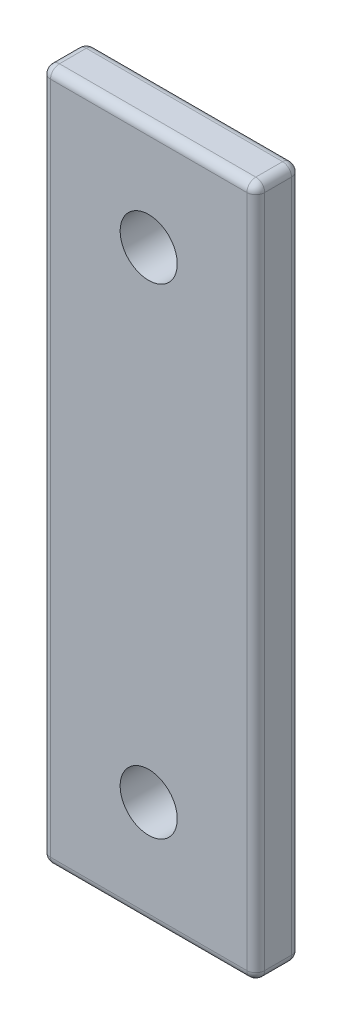
ISO-10303-21;
HEADER;
FILE_DESCRIPTION(('STEP AP214'),'2;1');
FILE_NAME('part.step','',(''),(''),'','','');
FILE_SCHEMA(('AUTOMOTIVE_DESIGN { 1 0 10303 214 1 1 1 1 }'));
ENDSEC;
DATA;
#1=APPLICATION_CONTEXT('core data for automotive mechanical design processes');
#2=APPLICATION_PROTOCOL_DEFINITION('international standard','automotive_design',2000,#1);
#3=PRODUCT_CONTEXT('',#1,'mechanical');
#4=PRODUCT('Part','Part','',(#3));
#5=PRODUCT_RELATED_PRODUCT_CATEGORY('part','',(#4));
#6=PRODUCT_DEFINITION_FORMATION('','',#4);
#7=PRODUCT_DEFINITION_CONTEXT('part definition',#1,'design');
#8=PRODUCT_DEFINITION('design','',#6,#7);
#9=PRODUCT_DEFINITION_SHAPE('','',#8);
#10=(LENGTH_UNIT() NAMED_UNIT(*) SI_UNIT(.MILLI.,.METRE.));
#11=(NAMED_UNIT(*) PLANE_ANGLE_UNIT() SI_UNIT($,.RADIAN.));
#12=(NAMED_UNIT(*) SI_UNIT($,.STERADIAN.) SOLID_ANGLE_UNIT());
#13=UNCERTAINTY_MEASURE_WITH_UNIT(LENGTH_MEASURE(1.E-05),#10,'distance_accuracy_value','');
#14=(GEOMETRIC_REPRESENTATION_CONTEXT(3) GLOBAL_UNCERTAINTY_ASSIGNED_CONTEXT((#13)) GLOBAL_UNIT_ASSIGNED_CONTEXT((#10,
#11,#12)) REPRESENTATION_CONTEXT('',''));
#15=CARTESIAN_POINT('',(0.,0.,0.));
#16=DIRECTION('',(0.,0.,1.));
#17=DIRECTION('',(1.,0.,0.));
#18=AXIS2_PLACEMENT_3D('',#15,#16,#17);
#19=CARTESIAN_POINT('',(24.,-77.5,10.));
#20=DIRECTION('',(-1.,0.,0.));
#21=DIRECTION('',(0.,0.,1.));
#22=AXIS2_PLACEMENT_3D('',#19,#20,#21);
#23=PLANE('',#22);
#24=DIRECTION('',(0.,1.,0.));
#25=VECTOR('',#24,1.);
#26=CARTESIAN_POINT('',(24.,77.5,2.));
#27=LINE('',#26,#25);
#28=CARTESIAN_POINT('',(24.,-75.5,2.));
#29=VERTEX_POINT('',#28);
#30=CARTESIAN_POINT('',(24.,75.5,2.));
#31=VERTEX_POINT('',#30);
#32=EDGE_CURVE('E191',#29,#31,#27,.T.);
#33=ORIENTED_EDGE('',*,*,#32,.T.);
#34=DIRECTION('',(0.,0.,-1.));
#35=VECTOR('',#34,1.);
#36=CARTESIAN_POINT('',(24.,75.5,10.));
#37=LINE('',#36,#35);
#38=CARTESIAN_POINT('',(24.,75.5,8.));
#39=VERTEX_POINT('',#38);
#40=EDGE_CURVE('E238',#31,#39,#37,.F.);
#41=ORIENTED_EDGE('',*,*,#40,.T.);
#42=DIRECTION('',(0.,1.,0.));
#43=VECTOR('',#42,1.);
#44=CARTESIAN_POINT('',(24.,-77.5,8.));
#45=LINE('',#44,#43);
#46=CARTESIAN_POINT('',(24.,-75.5,8.));
#47=VERTEX_POINT('',#46);
#48=EDGE_CURVE('E194',#39,#47,#45,.F.);
#49=ORIENTED_EDGE('',*,*,#48,.T.);
#50=DIRECTION('',(0.,0.,-1.));
#51=VECTOR('',#50,1.);
#52=CARTESIAN_POINT('',(24.,-75.5,10.));
#53=LINE('',#52,#51);
#54=EDGE_CURVE('E236',#47,#29,#53,.T.);
#55=ORIENTED_EDGE('',*,*,#54,.T.);
#56=EDGE_LOOP('',(#33,#41,#49,#55));
#57=FACE_BOUND('',#56,.T.);
#58=ADVANCED_FACE('F41',(#57),#23,.F.);
#59=CARTESIAN_POINT('',(-24.,77.5,10.));
#60=DIRECTION('',(0.,-1.,0.));
#61=DIRECTION('',(0.,0.,-1.));
#62=AXIS2_PLACEMENT_3D('',#59,#60,#61);
#63=PLANE('',#62);
#64=DIRECTION('',(-1.,0.,0.));
#65=VECTOR('',#64,1.);
#66=CARTESIAN_POINT('',(-24.,77.5,8.));
#67=LINE('',#66,#65);
#68=CARTESIAN_POINT('',(-22.,77.5,8.));
#69=VERTEX_POINT('',#68);
#70=CARTESIAN_POINT('',(22.,77.5,8.));
#71=VERTEX_POINT('',#70);
#72=EDGE_CURVE('E188',#69,#71,#67,.F.);
#73=ORIENTED_EDGE('',*,*,#72,.T.);
#74=DIRECTION('',(0.,0.,-1.));
#75=VECTOR('',#74,1.);
#76=CARTESIAN_POINT('',(22.,77.5,10.));
#77=LINE('',#76,#75);
#78=CARTESIAN_POINT('',(22.,77.5,2.));
#79=VERTEX_POINT('',#78);
#80=EDGE_CURVE('E234',#71,#79,#77,.T.);
#81=ORIENTED_EDGE('',*,*,#80,.T.);
#82=DIRECTION('',(-1.,0.,0.));
#83=VECTOR('',#82,1.);
#84=CARTESIAN_POINT('',(-24.,77.5,2.));
#85=LINE('',#84,#83);
#86=CARTESIAN_POINT('',(-22.,77.5,2.));
#87=VERTEX_POINT('',#86);
#88=EDGE_CURVE('E185',#79,#87,#85,.T.);
#89=ORIENTED_EDGE('',*,*,#88,.T.);
#90=DIRECTION('',(0.,0.,-1.));
#91=VECTOR('',#90,1.);
#92=CARTESIAN_POINT('',(-22.,77.5,10.));
#93=LINE('',#92,#91);
#94=EDGE_CURVE('E232',#87,#69,#93,.F.);
#95=ORIENTED_EDGE('',*,*,#94,.T.);
#96=EDGE_LOOP('',(#73,#81,#89,#95));
#97=FACE_BOUND('',#96,.T.);
#98=ADVANCED_FACE('F341',(#97),#63,.F.);
#99=CARTESIAN_POINT('',(-24.,-77.5,10.));
#100=DIRECTION('',(1.,0.,0.));
#101=DIRECTION('',(0.,0.,-1.));
#102=AXIS2_PLACEMENT_3D('',#99,#100,#101);
#103=PLANE('',#102);
#104=DIRECTION('',(0.,-1.,0.));
#105=VECTOR('',#104,1.);
#106=CARTESIAN_POINT('',(-24.,-77.5,2.));
#107=LINE('',#106,#105);
#108=CARTESIAN_POINT('',(-24.,75.5,2.));
#109=VERTEX_POINT('',#108);
#110=CARTESIAN_POINT('',(-24.,-75.5,2.));
#111=VERTEX_POINT('',#110);
#112=EDGE_CURVE('E181',#109,#111,#107,.T.);
#113=ORIENTED_EDGE('',*,*,#112,.T.);
#114=DIRECTION('',(0.,0.,-1.));
#115=VECTOR('',#114,1.);
#116=CARTESIAN_POINT('',(-24.,-75.5,10.));
#117=LINE('',#116,#115);
#118=CARTESIAN_POINT('',(-24.,-75.5,8.));
#119=VERTEX_POINT('',#118);
#120=EDGE_CURVE('E11',#111,#119,#117,.F.);
#121=ORIENTED_EDGE('',*,*,#120,.T.);
#122=DIRECTION('',(0.,-1.,0.));
#123=VECTOR('',#122,1.);
#124=CARTESIAN_POINT('',(-24.,-77.5,8.));
#125=LINE('',#124,#123);
#126=CARTESIAN_POINT('',(-24.,75.5,8.));
#127=VERTEX_POINT('',#126);
#128=EDGE_CURVE('E183',#119,#127,#125,.F.);
#129=ORIENTED_EDGE('',*,*,#128,.T.);
#130=DIRECTION('',(0.,0.,-1.));
#131=VECTOR('',#130,1.);
#132=CARTESIAN_POINT('',(-24.,75.5,10.));
#133=LINE('',#132,#131);
#134=EDGE_CURVE('E50',#127,#109,#133,.T.);
#135=ORIENTED_EDGE('',*,*,#134,.T.);
#136=EDGE_LOOP('',(#113,#121,#129,#135));
#137=FACE_BOUND('',#136,.T.);
#138=ADVANCED_FACE('F329',(#137),#103,.F.);
#139=CARTESIAN_POINT('',(-24.,-77.5,10.));
#140=DIRECTION('',(0.,1.,0.));
#141=DIRECTION('',(0.,0.,1.));
#142=AXIS2_PLACEMENT_3D('',#139,#140,#141);
#143=PLANE('',#142);
#144=DIRECTION('',(1.,0.,0.));
#145=VECTOR('',#144,1.);
#146=CARTESIAN_POINT('',(24.,-77.5,2.));
#147=LINE('',#146,#145);
#148=CARTESIAN_POINT('',(-22.,-77.5,2.));
#149=VERTEX_POINT('',#148);
#150=CARTESIAN_POINT('',(22.,-77.5,2.));
#151=VERTEX_POINT('',#150);
#152=EDGE_CURVE('E173',#149,#151,#147,.T.);
#153=ORIENTED_EDGE('',*,*,#152,.T.);
#154=DIRECTION('',(0.,0.,-1.));
#155=VECTOR('',#154,1.);
#156=CARTESIAN_POINT('',(22.,-77.5,10.));
#157=LINE('',#156,#155);
#158=CARTESIAN_POINT('',(22.,-77.5,8.));
#159=VERTEX_POINT('',#158);
#160=EDGE_CURVE('E242',#151,#159,#157,.F.);
#161=ORIENTED_EDGE('',*,*,#160,.T.);
#162=DIRECTION('',(1.,0.,0.));
#163=VECTOR('',#162,1.);
#164=CARTESIAN_POINT('',(-24.,-77.5,8.));
#165=LINE('',#164,#163);
#166=CARTESIAN_POINT('',(-22.,-77.5,8.));
#167=VERTEX_POINT('',#166);
#168=EDGE_CURVE('E154',#159,#167,#165,.F.);
#169=ORIENTED_EDGE('',*,*,#168,.T.);
#170=DIRECTION('',(0.,0.,-1.));
#171=VECTOR('',#170,1.);
#172=CARTESIAN_POINT('',(-22.,-77.5,10.));
#173=LINE('',#172,#171);
#174=EDGE_CURVE('E240',#167,#149,#173,.T.);
#175=ORIENTED_EDGE('',*,*,#174,.T.);
#176=EDGE_LOOP('',(#153,#161,#169,#175));
#177=FACE_BOUND('',#176,.T.);
#178=ADVANCED_FACE('F320',(#177),#143,.F.);
#179=CARTESIAN_POINT('',(0.,0.,10.));
#180=DIRECTION('',(0.,0.,-1.));
#181=DIRECTION('',(-1.,0.,0.));
#182=AXIS2_PLACEMENT_3D('',#179,#180,#181);
#183=PLANE('',#182);
#184=CARTESIAN_POINT('',(0.,-53.85,10.));
#185=DIRECTION('',(0.,0.,1.));
#186=DIRECTION('',(-1.,0.,0.));
#187=AXIS2_PLACEMENT_3D('',#184,#185,#186);
#188=CIRCLE('',#187,6.4);
#189=CARTESIAN_POINT('',(-6.4,-53.85,10.));
#190=VERTEX_POINT('',#189);
#191=EDGE_CURVE('E271',#190,#190,#188,.T.);
#192=ORIENTED_EDGE('',*,*,#191,.F.);
#193=EDGE_LOOP('',(#192));
#194=FACE_BOUND('',#193,.T.);
#195=CARTESIAN_POINT('',(0.,53.85,10.));
#196=DIRECTION('',(0.,0.,-1.));
#197=DIRECTION('',(-1.,0.,0.));
#198=AXIS2_PLACEMENT_3D('',#195,#196,#197);
#199=CIRCLE('',#198,6.4);
#200=CARTESIAN_POINT('',(-6.4,53.85,10.));
#201=VERTEX_POINT('',#200);
#202=EDGE_CURVE('E259',#201,#201,#199,.T.);
#203=ORIENTED_EDGE('',*,*,#202,.T.);
#204=EDGE_LOOP('',(#203));
#205=FACE_BOUND('',#204,.T.);
#206=DIRECTION('',(0.,-1.,0.));
#207=VECTOR('',#206,1.);
#208=CARTESIAN_POINT('',(-22.,0.,10.));
#209=LINE('',#208,#207);
#210=CARTESIAN_POINT('',(-22.,75.5,10.));
#211=VERTEX_POINT('',#210);
#212=CARTESIAN_POINT('',(-22.,-75.5,10.));
#213=VERTEX_POINT('',#212);
#214=EDGE_CURVE('E172',#211,#213,#209,.T.);
#215=ORIENTED_EDGE('',*,*,#214,.T.);
#216=DIRECTION('',(1.,0.,0.));
#217=VECTOR('',#216,1.);
#218=CARTESIAN_POINT('',(0.,-75.5,10.));
#219=LINE('',#218,#217);
#220=CARTESIAN_POINT('',(22.,-75.5,10.));
#221=VERTEX_POINT('',#220);
#222=EDGE_CURVE('E151',#213,#221,#219,.T.);
#223=ORIENTED_EDGE('',*,*,#222,.T.);
#224=DIRECTION('',(0.,1.,0.));
#225=VECTOR('',#224,1.);
#226=CARTESIAN_POINT('',(22.,0.,10.));
#227=LINE('',#226,#225);
#228=CARTESIAN_POINT('',(22.,75.5,10.));
#229=VERTEX_POINT('',#228);
#230=EDGE_CURVE('E160',#221,#229,#227,.T.);
#231=ORIENTED_EDGE('',*,*,#230,.T.);
#232=DIRECTION('',(-1.,0.,0.));
#233=VECTOR('',#232,1.);
#234=CARTESIAN_POINT('',(0.,75.5,10.));
#235=LINE('',#234,#233);
#236=EDGE_CURVE('E166',#229,#211,#235,.T.);
#237=ORIENTED_EDGE('',*,*,#236,.T.);
#238=EDGE_LOOP('',(#215,#223,#231,#237));
#239=FACE_BOUND('',#238,.T.);
#240=ADVANCED_FACE('F170',(#194,#205,#239),#183,.F.);
#241=CARTESIAN_POINT('',(0.,0.,0.));
#242=DIRECTION('',(0.,0.,-1.));
#243=DIRECTION('',(-1.,0.,0.));
#244=AXIS2_PLACEMENT_3D('',#241,#242,#243);
#245=PLANE('',#244);
#246=CARTESIAN_POINT('',(0.,-53.85,0.));
#247=DIRECTION('',(0.,0.,1.));
#248=DIRECTION('',(-1.,0.,0.));
#249=AXIS2_PLACEMENT_3D('',#246,#247,#248);
#250=CIRCLE('',#249,6.4);
#251=CARTESIAN_POINT('',(-6.4,-53.85,0.));
#252=VERTEX_POINT('',#251);
#253=EDGE_CURVE('E274',#252,#252,#250,.T.);
#254=ORIENTED_EDGE('',*,*,#253,.T.);
#255=EDGE_LOOP('',(#254));
#256=FACE_BOUND('',#255,.T.);
#257=CARTESIAN_POINT('',(0.,53.85,0.));
#258=DIRECTION('',(0.,0.,-1.));
#259=DIRECTION('',(-1.,0.,0.));
#260=AXIS2_PLACEMENT_3D('',#257,#258,#259);
#261=CIRCLE('',#260,6.4);
#262=CARTESIAN_POINT('',(-6.4,53.85,0.));
#263=VERTEX_POINT('',#262);
#264=EDGE_CURVE('E266',#263,#263,#261,.T.);
#265=ORIENTED_EDGE('',*,*,#264,.F.);
#266=EDGE_LOOP('',(#265));
#267=FACE_BOUND('',#266,.T.);
#268=DIRECTION('',(0.,-1.,0.));
#269=VECTOR('',#268,1.);
#270=CARTESIAN_POINT('',(-22.,77.5,0.));
#271=LINE('',#270,#269);
#272=CARTESIAN_POINT('',(-22.,-75.5,0.));
#273=VERTEX_POINT('',#272);
#274=CARTESIAN_POINT('',(-22.,75.5,0.));
#275=VERTEX_POINT('',#274);
#276=EDGE_CURVE('E202',#273,#275,#271,.F.);
#277=ORIENTED_EDGE('',*,*,#276,.T.);
#278=DIRECTION('',(-1.,0.,0.));
#279=VECTOR('',#278,1.);
#280=CARTESIAN_POINT('',(24.,75.5,0.));
#281=LINE('',#280,#279);
#282=CARTESIAN_POINT('',(22.,75.5,0.));
#283=VERTEX_POINT('',#282);
#284=EDGE_CURVE('E143',#275,#283,#281,.F.);
#285=ORIENTED_EDGE('',*,*,#284,.T.);
#286=DIRECTION('',(0.,1.,0.));
#287=VECTOR('',#286,1.);
#288=CARTESIAN_POINT('',(22.,-77.5,0.));
#289=LINE('',#288,#287);
#290=CARTESIAN_POINT('',(22.,-75.5,0.));
#291=VERTEX_POINT('',#290);
#292=EDGE_CURVE('E196',#283,#291,#289,.F.);
#293=ORIENTED_EDGE('',*,*,#292,.T.);
#294=DIRECTION('',(1.,0.,0.));
#295=VECTOR('',#294,1.);
#296=CARTESIAN_POINT('',(-24.,-75.5,0.));
#297=LINE('',#296,#295);
#298=EDGE_CURVE('E199',#291,#273,#297,.F.);
#299=ORIENTED_EDGE('',*,*,#298,.T.);
#300=EDGE_LOOP('',(#277,#285,#293,#299));
#301=FACE_BOUND('',#300,.T.);
#302=ADVANCED_FACE('F293',(#256,#267,#301),#245,.T.);
#303=CARTESIAN_POINT('',(0.,75.5,8.));
#304=DIRECTION('',(-1.,0.,0.));
#305=DIRECTION('',(0.,0.,1.));
#306=AXIS2_PLACEMENT_3D('',#303,#304,#305);
#307=CYLINDRICAL_SURFACE('',#306,2.);
#308=ORIENTED_EDGE('',*,*,#236,.F.);
#309=CARTESIAN_POINT('',(22.,75.5,8.));
#310=DIRECTION('',(-1.,0.,0.));
#311=DIRECTION('',(0.,0.,1.));
#312=AXIS2_PLACEMENT_3D('',#309,#310,#311);
#313=CIRCLE('',#312,2.);
#314=EDGE_CURVE('E210',#229,#71,#313,.T.);
#315=ORIENTED_EDGE('',*,*,#314,.T.);
#316=ORIENTED_EDGE('',*,*,#72,.F.);
#317=CARTESIAN_POINT('',(-22.,75.5,8.));
#318=DIRECTION('',(-1.,0.,0.));
#319=DIRECTION('',(0.,0.,1.));
#320=AXIS2_PLACEMENT_3D('',#317,#318,#319);
#321=CIRCLE('',#320,2.);
#322=EDGE_CURVE('E208',#69,#211,#321,.F.);
#323=ORIENTED_EDGE('',*,*,#322,.T.);
#324=EDGE_LOOP('',(#308,#315,#316,#323));
#325=FACE_BOUND('',#324,.T.);
#326=ADVANCED_FACE('F357',(#325),#307,.T.);
#327=CARTESIAN_POINT('',(-22.,0.,8.));
#328=DIRECTION('',(0.,-1.,0.));
#329=DIRECTION('',(0.,0.,-1.));
#330=AXIS2_PLACEMENT_3D('',#327,#328,#329);
#331=CYLINDRICAL_SURFACE('',#330,2.);
#332=ORIENTED_EDGE('',*,*,#128,.F.);
#333=CARTESIAN_POINT('',(-22.,-75.5,8.));
#334=DIRECTION('',(0.,-1.,0.));
#335=DIRECTION('',(0.,0.,-1.));
#336=AXIS2_PLACEMENT_3D('',#333,#334,#335);
#337=CIRCLE('',#336,2.);
#338=EDGE_CURVE('E227',#119,#213,#337,.F.);
#339=ORIENTED_EDGE('',*,*,#338,.T.);
#340=ORIENTED_EDGE('',*,*,#214,.F.);
#341=CARTESIAN_POINT('',(-22.,75.5,8.));
#342=DIRECTION('',(0.,-1.,0.));
#343=DIRECTION('',(0.,0.,-1.));
#344=AXIS2_PLACEMENT_3D('',#341,#342,#343);
#345=CIRCLE('',#344,2.);
#346=EDGE_CURVE('E224',#211,#127,#345,.T.);
#347=ORIENTED_EDGE('',*,*,#346,.T.);
#348=EDGE_LOOP('',(#332,#339,#340,#347));
#349=FACE_BOUND('',#348,.T.);
#350=ADVANCED_FACE('F279',(#349),#331,.T.);
#351=CARTESIAN_POINT('',(22.,0.,8.));
#352=DIRECTION('',(0.,1.,0.));
#353=DIRECTION('',(0.,0.,1.));
#354=AXIS2_PLACEMENT_3D('',#351,#352,#353);
#355=CYLINDRICAL_SURFACE('',#354,2.);
#356=ORIENTED_EDGE('',*,*,#48,.F.);
#357=CARTESIAN_POINT('',(22.,75.5,8.));
#358=DIRECTION('',(0.,1.,0.));
#359=DIRECTION('',(0.,0.,1.));
#360=AXIS2_PLACEMENT_3D('',#357,#358,#359);
#361=CIRCLE('',#360,2.);
#362=EDGE_CURVE('E142',#39,#229,#361,.F.);
#363=ORIENTED_EDGE('',*,*,#362,.T.);
#364=ORIENTED_EDGE('',*,*,#230,.F.);
#365=CARTESIAN_POINT('',(22.,-75.5,8.));
#366=DIRECTION('',(0.,1.,0.));
#367=DIRECTION('',(0.,0.,1.));
#368=AXIS2_PLACEMENT_3D('',#365,#366,#367);
#369=CIRCLE('',#368,2.);
#370=EDGE_CURVE('E132',#221,#47,#369,.T.);
#371=ORIENTED_EDGE('',*,*,#370,.T.);
#372=EDGE_LOOP('',(#356,#363,#364,#371));
#373=FACE_BOUND('',#372,.T.);
#374=ADVANCED_FACE('F161',(#373),#355,.T.);
#375=CARTESIAN_POINT('',(0.,-75.5,8.));
#376=DIRECTION('',(1.,0.,0.));
#377=DIRECTION('',(0.,0.,-1.));
#378=AXIS2_PLACEMENT_3D('',#375,#376,#377);
#379=CYLINDRICAL_SURFACE('',#378,2.);
#380=ORIENTED_EDGE('',*,*,#168,.F.);
#381=CARTESIAN_POINT('',(22.,-75.5,8.));
#382=DIRECTION('',(1.,0.,0.));
#383=DIRECTION('',(0.,0.,-1.));
#384=AXIS2_PLACEMENT_3D('',#381,#382,#383);
#385=CIRCLE('',#384,2.);
#386=EDGE_CURVE('E135',#159,#221,#385,.F.);
#387=ORIENTED_EDGE('',*,*,#386,.T.);
#388=ORIENTED_EDGE('',*,*,#222,.F.);
#389=CARTESIAN_POINT('',(-22.,-75.5,8.));
#390=DIRECTION('',(1.,0.,0.));
#391=DIRECTION('',(0.,0.,-1.));
#392=AXIS2_PLACEMENT_3D('',#389,#390,#391);
#393=CIRCLE('',#392,2.);
#394=EDGE_CURVE('E156',#213,#167,#393,.T.);
#395=ORIENTED_EDGE('',*,*,#394,.T.);
#396=EDGE_LOOP('',(#380,#387,#388,#395));
#397=FACE_BOUND('',#396,.T.);
#398=ADVANCED_FACE('F148',(#397),#379,.T.);
#399=CARTESIAN_POINT('',(-24.,-75.5,2.));
#400=DIRECTION('',(-1.,0.,0.));
#401=DIRECTION('',(0.,0.,1.));
#402=AXIS2_PLACEMENT_3D('',#399,#400,#401);
#403=CYLINDRICAL_SURFACE('',#402,2.);
#404=ORIENTED_EDGE('',*,*,#298,.F.);
#405=CARTESIAN_POINT('',(22.,-75.5,2.));
#406=DIRECTION('',(-1.,0.,0.));
#407=DIRECTION('',(0.,0.,1.));
#408=AXIS2_PLACEMENT_3D('',#405,#406,#407);
#409=CIRCLE('',#408,2.);
#410=EDGE_CURVE('E222',#291,#151,#409,.T.);
#411=ORIENTED_EDGE('',*,*,#410,.T.);
#412=ORIENTED_EDGE('',*,*,#152,.F.);
#413=CARTESIAN_POINT('',(-22.,-75.5,2.));
#414=DIRECTION('',(-1.,0.,0.));
#415=DIRECTION('',(0.,0.,1.));
#416=AXIS2_PLACEMENT_3D('',#413,#414,#415);
#417=CIRCLE('',#416,2.);
#418=EDGE_CURVE('E155',#149,#273,#417,.F.);
#419=ORIENTED_EDGE('',*,*,#418,.T.);
#420=EDGE_LOOP('',(#404,#411,#412,#419));
#421=FACE_BOUND('',#420,.T.);
#422=ADVANCED_FACE('F309',(#421),#403,.T.);
#423=CARTESIAN_POINT('',(22.,-77.5,2.));
#424=DIRECTION('',(0.,-1.,0.));
#425=DIRECTION('',(0.,0.,-1.));
#426=AXIS2_PLACEMENT_3D('',#423,#424,#425);
#427=CYLINDRICAL_SURFACE('',#426,2.);
#428=ORIENTED_EDGE('',*,*,#292,.F.);
#429=CARTESIAN_POINT('',(22.,75.5,2.));
#430=DIRECTION('',(0.,-1.,0.));
#431=DIRECTION('',(0.,0.,-1.));
#432=AXIS2_PLACEMENT_3D('',#429,#430,#431);
#433=CIRCLE('',#432,2.);
#434=EDGE_CURVE('E218',#283,#31,#433,.T.);
#435=ORIENTED_EDGE('',*,*,#434,.T.);
#436=ORIENTED_EDGE('',*,*,#32,.F.);
#437=CARTESIAN_POINT('',(22.,-75.5,2.));
#438=DIRECTION('',(0.,-1.,0.));
#439=DIRECTION('',(0.,0.,-1.));
#440=AXIS2_PLACEMENT_3D('',#437,#438,#439);
#441=CIRCLE('',#440,2.);
#442=EDGE_CURVE('E216',#29,#291,#441,.F.);
#443=ORIENTED_EDGE('',*,*,#442,.T.);
#444=EDGE_LOOP('',(#428,#435,#436,#443));
#445=FACE_BOUND('',#444,.T.);
#446=ADVANCED_FACE('F304',(#445),#427,.T.);
#447=CARTESIAN_POINT('',(-22.,-77.5,2.));
#448=DIRECTION('',(0.,1.,0.));
#449=DIRECTION('',(0.,0.,1.));
#450=AXIS2_PLACEMENT_3D('',#447,#448,#449);
#451=CYLINDRICAL_SURFACE('',#450,2.);
#452=ORIENTED_EDGE('',*,*,#276,.F.);
#453=CARTESIAN_POINT('',(-22.,-75.5,2.));
#454=DIRECTION('',(0.,1.,0.));
#455=DIRECTION('',(0.,0.,1.));
#456=AXIS2_PLACEMENT_3D('',#453,#454,#455);
#457=CIRCLE('',#456,2.);
#458=EDGE_CURVE('E58',#273,#111,#457,.T.);
#459=ORIENTED_EDGE('',*,*,#458,.T.);
#460=ORIENTED_EDGE('',*,*,#112,.F.);
#461=CARTESIAN_POINT('',(-22.,75.5,2.));
#462=DIRECTION('',(0.,1.,0.));
#463=DIRECTION('',(0.,0.,1.));
#464=AXIS2_PLACEMENT_3D('',#461,#462,#463);
#465=CIRCLE('',#464,2.);
#466=EDGE_CURVE('E229',#109,#275,#465,.F.);
#467=ORIENTED_EDGE('',*,*,#466,.T.);
#468=EDGE_LOOP('',(#452,#459,#460,#467));
#469=FACE_BOUND('',#468,.T.);
#470=ADVANCED_FACE('F290',(#469),#451,.T.);
#471=CARTESIAN_POINT('',(-24.,75.5,2.));
#472=DIRECTION('',(1.,0.,0.));
#473=DIRECTION('',(0.,0.,-1.));
#474=AXIS2_PLACEMENT_3D('',#471,#472,#473);
#475=CYLINDRICAL_SURFACE('',#474,2.);
#476=ORIENTED_EDGE('',*,*,#88,.F.);
#477=CARTESIAN_POINT('',(22.,75.5,2.));
#478=DIRECTION('',(1.,0.,0.));
#479=DIRECTION('',(0.,0.,-1.));
#480=AXIS2_PLACEMENT_3D('',#477,#478,#479);
#481=CIRCLE('',#480,2.);
#482=EDGE_CURVE('E214',#79,#283,#481,.F.);
#483=ORIENTED_EDGE('',*,*,#482,.T.);
#484=ORIENTED_EDGE('',*,*,#284,.F.);
#485=CARTESIAN_POINT('',(-22.,75.5,2.));
#486=DIRECTION('',(1.,0.,0.));
#487=DIRECTION('',(0.,0.,-1.));
#488=AXIS2_PLACEMENT_3D('',#485,#486,#487);
#489=CIRCLE('',#488,2.);
#490=EDGE_CURVE('E212',#275,#87,#489,.T.);
#491=ORIENTED_EDGE('',*,*,#490,.T.);
#492=EDGE_LOOP('',(#476,#483,#484,#491));
#493=FACE_BOUND('',#492,.T.);
#494=ADVANCED_FACE('F298',(#493),#475,.T.);
#495=CARTESIAN_POINT('',(22.,75.5,2.));
#496=DIRECTION('',(0.,0.,1.));
#497=DIRECTION('',(1.,0.,0.));
#498=AXIS2_PLACEMENT_3D('',#495,#496,#497);
#499=SPHERICAL_SURFACE('',#498,2.);
#500=ORIENTED_EDGE('',*,*,#434,.F.);
#501=ORIENTED_EDGE('',*,*,#482,.F.);
#502=CARTESIAN_POINT('',(22.,75.5,2.));
#503=DIRECTION('',(0.,0.,1.));
#504=DIRECTION('',(1.,0.,0.));
#505=AXIS2_PLACEMENT_3D('',#502,#503,#504);
#506=CIRCLE('',#505,2.);
#507=EDGE_CURVE('E167',#31,#79,#506,.T.);
#508=ORIENTED_EDGE('',*,*,#507,.F.);
#509=EDGE_LOOP('',(#500,#501,#508));
#510=FACE_BOUND('',#509,.T.);
#511=ADVANCED_FACE('F362',(#510),#499,.T.);
#512=CARTESIAN_POINT('',(22.,75.5,10.));
#513=DIRECTION('',(0.,0.,-1.));
#514=DIRECTION('',(-1.,0.,0.));
#515=AXIS2_PLACEMENT_3D('',#512,#513,#514);
#516=CYLINDRICAL_SURFACE('',#515,2.);
#517=ORIENTED_EDGE('',*,*,#507,.T.);
#518=ORIENTED_EDGE('',*,*,#80,.F.);
#519=CARTESIAN_POINT('',(22.,75.5,8.));
#520=DIRECTION('',(0.,0.,1.));
#521=DIRECTION('',(1.,0.,0.));
#522=AXIS2_PLACEMENT_3D('',#519,#520,#521);
#523=CIRCLE('',#522,2.);
#524=EDGE_CURVE('E245',#39,#71,#523,.T.);
#525=ORIENTED_EDGE('',*,*,#524,.F.);
#526=ORIENTED_EDGE('',*,*,#40,.F.);
#527=EDGE_LOOP('',(#517,#518,#525,#526));
#528=FACE_BOUND('',#527,.T.);
#529=ADVANCED_FACE('F372',(#528),#516,.T.);
#530=CARTESIAN_POINT('',(22.,75.5,8.));
#531=DIRECTION('',(0.,0.,1.));
#532=DIRECTION('',(1.,0.,0.));
#533=AXIS2_PLACEMENT_3D('',#530,#531,#532);
#534=SPHERICAL_SURFACE('',#533,2.);
#535=ORIENTED_EDGE('',*,*,#524,.T.);
#536=ORIENTED_EDGE('',*,*,#314,.F.);
#537=ORIENTED_EDGE('',*,*,#362,.F.);
#538=EDGE_LOOP('',(#535,#536,#537));
#539=FACE_BOUND('',#538,.T.);
#540=ADVANCED_FACE('F369',(#539),#534,.T.);
#541=CARTESIAN_POINT('',(22.,-75.5,2.));
#542=DIRECTION('',(0.,0.,1.));
#543=DIRECTION('',(1.,0.,0.));
#544=AXIS2_PLACEMENT_3D('',#541,#542,#543);
#545=SPHERICAL_SURFACE('',#544,2.);
#546=ORIENTED_EDGE('',*,*,#410,.F.);
#547=ORIENTED_EDGE('',*,*,#442,.F.);
#548=CARTESIAN_POINT('',(22.,-75.5,2.));
#549=DIRECTION('',(0.,0.,1.));
#550=DIRECTION('',(1.,0.,0.));
#551=AXIS2_PLACEMENT_3D('',#548,#549,#550);
#552=CIRCLE('',#551,2.);
#553=EDGE_CURVE('E248',#151,#29,#552,.T.);
#554=ORIENTED_EDGE('',*,*,#553,.F.);
#555=EDGE_LOOP('',(#546,#547,#554));
#556=FACE_BOUND('',#555,.T.);
#557=ADVANCED_FACE('F314',(#556),#545,.T.);
#558=CARTESIAN_POINT('',(22.,-75.5,10.));
#559=DIRECTION('',(0.,0.,-1.));
#560=DIRECTION('',(-1.,0.,0.));
#561=AXIS2_PLACEMENT_3D('',#558,#559,#560);
#562=CYLINDRICAL_SURFACE('',#561,2.);
#563=ORIENTED_EDGE('',*,*,#553,.T.);
#564=ORIENTED_EDGE('',*,*,#54,.F.);
#565=CARTESIAN_POINT('',(22.,-75.5,8.));
#566=DIRECTION('',(0.,0.,1.));
#567=DIRECTION('',(1.,0.,0.));
#568=AXIS2_PLACEMENT_3D('',#565,#566,#567);
#569=CIRCLE('',#568,2.);
#570=EDGE_CURVE('E137',#159,#47,#569,.T.);
#571=ORIENTED_EDGE('',*,*,#570,.F.);
#572=ORIENTED_EDGE('',*,*,#160,.F.);
#573=EDGE_LOOP('',(#563,#564,#571,#572));
#574=FACE_BOUND('',#573,.T.);
#575=ADVANCED_FACE('F318',(#574),#562,.T.);
#576=CARTESIAN_POINT('',(22.,-75.5,8.));
#577=DIRECTION('',(0.,0.,1.));
#578=DIRECTION('',(1.,0.,0.));
#579=AXIS2_PLACEMENT_3D('',#576,#577,#578);
#580=SPHERICAL_SURFACE('',#579,2.);
#581=ORIENTED_EDGE('',*,*,#570,.T.);
#582=ORIENTED_EDGE('',*,*,#370,.F.);
#583=ORIENTED_EDGE('',*,*,#386,.F.);
#584=EDGE_LOOP('',(#581,#582,#583));
#585=FACE_BOUND('',#584,.T.);
#586=ADVANCED_FACE('F134',(#585),#580,.T.);
#587=CARTESIAN_POINT('',(-22.,-75.5,2.));
#588=DIRECTION('',(0.,0.,1.));
#589=DIRECTION('',(1.,0.,0.));
#590=AXIS2_PLACEMENT_3D('',#587,#588,#589);
#591=SPHERICAL_SURFACE('',#590,2.);
#592=ORIENTED_EDGE('',*,*,#458,.F.);
#593=ORIENTED_EDGE('',*,*,#418,.F.);
#594=CARTESIAN_POINT('',(-22.,-75.5,2.));
#595=DIRECTION('',(0.,0.,1.));
#596=DIRECTION('',(1.,0.,0.));
#597=AXIS2_PLACEMENT_3D('',#594,#595,#596);
#598=CIRCLE('',#597,2.);
#599=EDGE_CURVE('E252',#111,#149,#598,.T.);
#600=ORIENTED_EDGE('',*,*,#599,.F.);
#601=EDGE_LOOP('',(#592,#593,#600));
#602=FACE_BOUND('',#601,.T.);
#603=ADVANCED_FACE('F324',(#602),#591,.T.);
#604=CARTESIAN_POINT('',(-22.,-75.5,10.));
#605=DIRECTION('',(0.,0.,-1.));
#606=DIRECTION('',(-1.,0.,0.));
#607=AXIS2_PLACEMENT_3D('',#604,#605,#606);
#608=CYLINDRICAL_SURFACE('',#607,2.);
#609=ORIENTED_EDGE('',*,*,#599,.T.);
#610=ORIENTED_EDGE('',*,*,#174,.F.);
#611=CARTESIAN_POINT('',(-22.,-75.5,8.));
#612=DIRECTION('',(0.,0.,1.));
#613=DIRECTION('',(1.,0.,0.));
#614=AXIS2_PLACEMENT_3D('',#611,#612,#613);
#615=CIRCLE('',#614,2.);
#616=EDGE_CURVE('E255',#119,#167,#615,.T.);
#617=ORIENTED_EDGE('',*,*,#616,.F.);
#618=ORIENTED_EDGE('',*,*,#120,.F.);
#619=EDGE_LOOP('',(#609,#610,#617,#618));
#620=FACE_BOUND('',#619,.T.);
#621=ADVANCED_FACE('F327',(#620),#608,.T.);
#622=CARTESIAN_POINT('',(-22.,-75.5,8.));
#623=DIRECTION('',(0.,0.,1.));
#624=DIRECTION('',(1.,0.,0.));
#625=AXIS2_PLACEMENT_3D('',#622,#623,#624);
#626=SPHERICAL_SURFACE('',#625,2.);
#627=ORIENTED_EDGE('',*,*,#394,.F.);
#628=ORIENTED_EDGE('',*,*,#338,.F.);
#629=ORIENTED_EDGE('',*,*,#616,.T.);
#630=EDGE_LOOP('',(#627,#628,#629));
#631=FACE_BOUND('',#630,.T.);
#632=ADVANCED_FACE('F331',(#631),#626,.T.);
#633=CARTESIAN_POINT('',(-22.,75.5,2.));
#634=DIRECTION('',(0.,0.,1.));
#635=DIRECTION('',(1.,0.,0.));
#636=AXIS2_PLACEMENT_3D('',#633,#634,#635);
#637=SPHERICAL_SURFACE('',#636,2.);
#638=ORIENTED_EDGE('',*,*,#490,.F.);
#639=ORIENTED_EDGE('',*,*,#466,.F.);
#640=CARTESIAN_POINT('',(-22.,75.5,2.));
#641=DIRECTION('',(0.,0.,1.));
#642=DIRECTION('',(1.,0.,0.));
#643=AXIS2_PLACEMENT_3D('',#640,#641,#642);
#644=CIRCLE('',#643,2.);
#645=EDGE_CURVE('E45',#87,#109,#644,.T.);
#646=ORIENTED_EDGE('',*,*,#645,.F.);
#647=EDGE_LOOP('',(#638,#639,#646));
#648=FACE_BOUND('',#647,.T.);
#649=ADVANCED_FACE('F43',(#648),#637,.T.);
#650=CARTESIAN_POINT('',(-22.,75.5,10.));
#651=DIRECTION('',(0.,0.,-1.));
#652=DIRECTION('',(-1.,0.,0.));
#653=AXIS2_PLACEMENT_3D('',#650,#651,#652);
#654=CYLINDRICAL_SURFACE('',#653,2.);
#655=ORIENTED_EDGE('',*,*,#645,.T.);
#656=ORIENTED_EDGE('',*,*,#134,.F.);
#657=CARTESIAN_POINT('',(-22.,75.5,8.));
#658=DIRECTION('',(0.,0.,1.));
#659=DIRECTION('',(1.,0.,0.));
#660=AXIS2_PLACEMENT_3D('',#657,#658,#659);
#661=CIRCLE('',#660,2.);
#662=EDGE_CURVE('E258',#69,#127,#661,.T.);
#663=ORIENTED_EDGE('',*,*,#662,.F.);
#664=ORIENTED_EDGE('',*,*,#94,.F.);
#665=EDGE_LOOP('',(#655,#656,#663,#664));
#666=FACE_BOUND('',#665,.T.);
#667=ADVANCED_FACE('F285',(#666),#654,.T.);
#668=CARTESIAN_POINT('',(-22.,75.5,8.));
#669=DIRECTION('',(0.,0.,1.));
#670=DIRECTION('',(1.,0.,0.));
#671=AXIS2_PLACEMENT_3D('',#668,#669,#670);
#672=SPHERICAL_SURFACE('',#671,2.);
#673=ORIENTED_EDGE('',*,*,#346,.F.);
#674=ORIENTED_EDGE('',*,*,#322,.F.);
#675=ORIENTED_EDGE('',*,*,#662,.T.);
#676=EDGE_LOOP('',(#673,#674,#675));
#677=FACE_BOUND('',#676,.T.);
#678=ADVANCED_FACE('F281',(#677),#672,.T.);
#679=CARTESIAN_POINT('',(0.,53.85,10.));
#680=DIRECTION('',(0.,0.,-1.));
#681=DIRECTION('',(-1.,0.,0.));
#682=AXIS2_PLACEMENT_3D('',#679,#680,#681);
#683=CYLINDRICAL_SURFACE('',#682,6.4);
#684=ORIENTED_EDGE('',*,*,#202,.F.);
#685=EDGE_LOOP('',(#684));
#686=FACE_BOUND('',#685,.T.);
#687=ORIENTED_EDGE('',*,*,#264,.T.);
#688=EDGE_LOOP('',(#687));
#689=FACE_BOUND('',#688,.T.);
#690=ADVANCED_FACE('F433',(#686,#689),#683,.F.);
#691=CARTESIAN_POINT('',(0.,-53.85,10.));
#692=DIRECTION('',(0.,0.,-1.));
#693=DIRECTION('',(-1.,0.,0.));
#694=AXIS2_PLACEMENT_3D('',#691,#692,#693);
#695=CYLINDRICAL_SURFACE('',#694,6.4);
#696=ORIENTED_EDGE('',*,*,#191,.T.);
#697=EDGE_LOOP('',(#696));
#698=FACE_BOUND('',#697,.T.);
#699=ORIENTED_EDGE('',*,*,#253,.F.);
#700=EDGE_LOOP('',(#699));
#701=FACE_BOUND('',#700,.T.);
#702=ADVANCED_FACE('F443',(#698,#701),#695,.F.);
#703=CLOSED_SHELL('',(#58,#98,#138,#178,#240,#302,#326,#350,#374,#398,#422,#446,#470,#494,#511,
#529,#540,#557,#575,#586,#603,#621,#632,#649,#667,#678,#690,#702));
#704=MANIFOLD_SOLID_BREP('B2',#703);
#705=ADVANCED_BREP_SHAPE_REPRESENTATION('',(#18,#704),#14);
#706=SHAPE_DEFINITION_REPRESENTATION(#9,#705);
ENDSEC;
END-ISO-10303-21;
